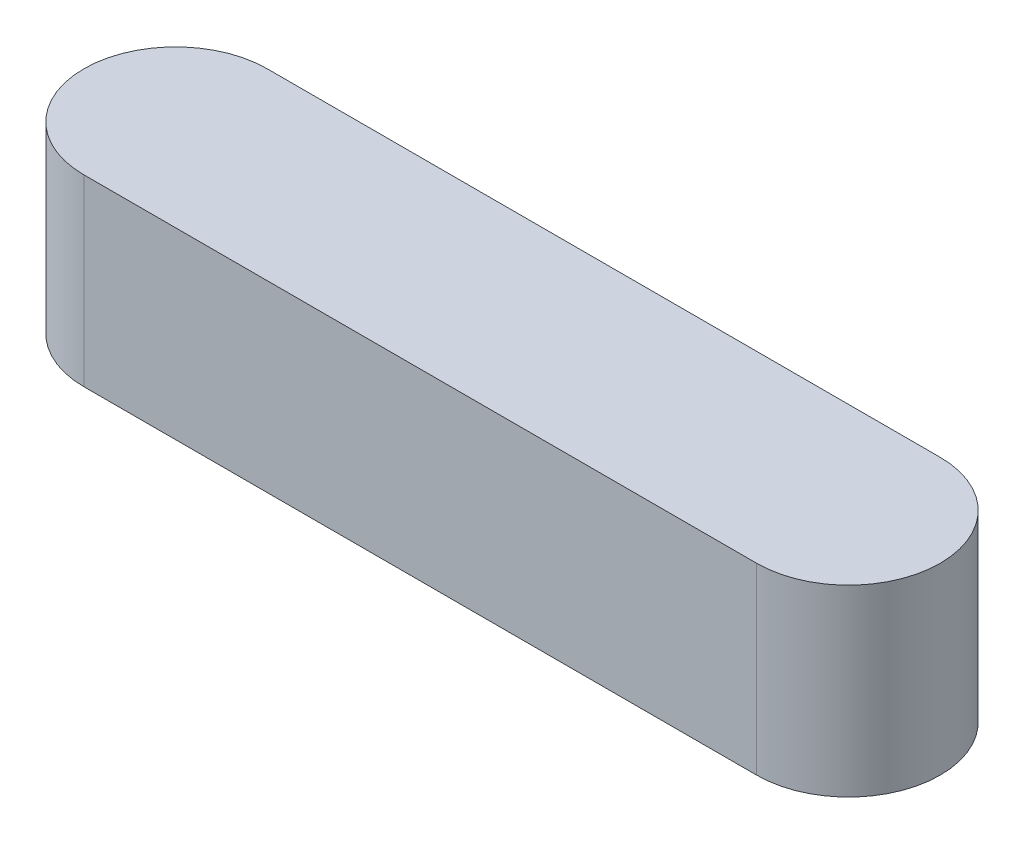
ISO-10303-21;
HEADER;
FILE_DESCRIPTION(('STEP AP214'),'2;1');
FILE_NAME('part.step','',(''),(''),'','','');
FILE_SCHEMA(('AUTOMOTIVE_DESIGN { 1 0 10303 214 1 1 1 1 }'));
ENDSEC;
DATA;
#1=APPLICATION_CONTEXT('core data for automotive mechanical design processes');
#2=APPLICATION_PROTOCOL_DEFINITION('international standard','automotive_design',2000,#1);
#3=PRODUCT_CONTEXT('',#1,'mechanical');
#4=PRODUCT('Part','Part','',(#3));
#5=PRODUCT_RELATED_PRODUCT_CATEGORY('part','',(#4));
#6=PRODUCT_DEFINITION_FORMATION('','',#4);
#7=PRODUCT_DEFINITION_CONTEXT('part definition',#1,'design');
#8=PRODUCT_DEFINITION('design','',#6,#7);
#9=PRODUCT_DEFINITION_SHAPE('','',#8);
#10=(LENGTH_UNIT() NAMED_UNIT(*) SI_UNIT(.MILLI.,.METRE.));
#11=(NAMED_UNIT(*) PLANE_ANGLE_UNIT() SI_UNIT($,.RADIAN.));
#12=(NAMED_UNIT(*) SI_UNIT($,.STERADIAN.) SOLID_ANGLE_UNIT());
#13=UNCERTAINTY_MEASURE_WITH_UNIT(LENGTH_MEASURE(1.E-05),#10,'distance_accuracy_value','');
#14=(GEOMETRIC_REPRESENTATION_CONTEXT(3) GLOBAL_UNCERTAINTY_ASSIGNED_CONTEXT((#13)) GLOBAL_UNIT_ASSIGNED_CONTEXT((#10,
#11,#12)) REPRESENTATION_CONTEXT('',''));
#15=CARTESIAN_POINT('',(0.,0.,0.));
#16=DIRECTION('',(0.,0.,1.));
#17=DIRECTION('',(1.,0.,0.));
#18=AXIS2_PLACEMENT_3D('',#15,#16,#17);
#19=CARTESIAN_POINT('',(0.,6.,0.));
#20=DIRECTION('',(0.,-1.,0.));
#21=DIRECTION('',(0.,0.,-1.));
#22=AXIS2_PLACEMENT_3D('',#19,#20,#21);
#23=CYLINDRICAL_SURFACE('',#22,3.);
#24=CARTESIAN_POINT('',(0.,0.,0.));
#25=DIRECTION('',(0.,1.,0.));
#26=DIRECTION('',(0.,0.,1.));
#27=AXIS2_PLACEMENT_3D('',#24,#25,#26);
#28=CIRCLE('',#27,3.);
#29=CARTESIAN_POINT('',(0.,0.,-3.));
#30=VERTEX_POINT('',#29);
#31=CARTESIAN_POINT('',(0.,0.,3.));
#32=VERTEX_POINT('',#31);
#33=EDGE_CURVE('E95',#30,#32,#28,.T.);
#34=ORIENTED_EDGE('',*,*,#33,.T.);
#35=DIRECTION('',(0.,-1.,0.));
#36=VECTOR('',#35,1.);
#37=CARTESIAN_POINT('',(0.,6.,3.));
#38=LINE('',#37,#36);
#39=CARTESIAN_POINT('',(0.,6.,3.));
#40=VERTEX_POINT('',#39);
#41=EDGE_CURVE('E11',#40,#32,#38,.T.);
#42=ORIENTED_EDGE('',*,*,#41,.F.);
#43=CARTESIAN_POINT('',(0.,6.,0.));
#44=DIRECTION('',(0.,1.,0.));
#45=DIRECTION('',(0.,0.,1.));
#46=AXIS2_PLACEMENT_3D('',#43,#44,#45);
#47=CIRCLE('',#46,3.);
#48=CARTESIAN_POINT('',(0.,6.,-3.));
#49=VERTEX_POINT('',#48);
#50=EDGE_CURVE('E83',#49,#40,#47,.T.);
#51=ORIENTED_EDGE('',*,*,#50,.F.);
#52=DIRECTION('',(0.,-1.,0.));
#53=VECTOR('',#52,1.);
#54=CARTESIAN_POINT('',(0.,6.,-3.));
#55=LINE('',#54,#53);
#56=EDGE_CURVE('E91',#49,#30,#55,.T.);
#57=ORIENTED_EDGE('',*,*,#56,.T.);
#58=EDGE_LOOP('',(#34,#42,#51,#57));
#59=FACE_BOUND('',#58,.T.);
#60=ADVANCED_FACE('F32',(#59),#23,.T.);
#61=CARTESIAN_POINT('',(0.,6.,3.));
#62=DIRECTION('',(0.,0.,-1.));
#63=DIRECTION('',(-1.,0.,0.));
#64=AXIS2_PLACEMENT_3D('',#61,#62,#63);
#65=PLANE('',#64);
#66=DIRECTION('',(1.,0.,0.));
#67=VECTOR('',#66,1.);
#68=CARTESIAN_POINT('',(0.,0.,3.));
#69=LINE('',#68,#67);
#70=CARTESIAN_POINT('',(22.,0.,3.));
#71=VERTEX_POINT('',#70);
#72=EDGE_CURVE('E87',#32,#71,#69,.T.);
#73=ORIENTED_EDGE('',*,*,#72,.T.);
#74=DIRECTION('',(0.,-1.,0.));
#75=VECTOR('',#74,1.);
#76=CARTESIAN_POINT('',(22.,6.,3.));
#77=LINE('',#76,#75);
#78=CARTESIAN_POINT('',(22.,6.,3.));
#79=VERTEX_POINT('',#78);
#80=EDGE_CURVE('E40',#79,#71,#77,.T.);
#81=ORIENTED_EDGE('',*,*,#80,.F.);
#82=DIRECTION('',(1.,0.,0.));
#83=VECTOR('',#82,1.);
#84=CARTESIAN_POINT('',(0.,6.,3.));
#85=LINE('',#84,#83);
#86=EDGE_CURVE('E78',#40,#79,#85,.T.);
#87=ORIENTED_EDGE('',*,*,#86,.F.);
#88=ORIENTED_EDGE('',*,*,#41,.T.);
#89=EDGE_LOOP('',(#73,#81,#87,#88));
#90=FACE_BOUND('',#89,.T.);
#91=ADVANCED_FACE('F86',(#90),#65,.F.);
#92=CARTESIAN_POINT('',(22.,6.,0.));
#93=DIRECTION('',(0.,-1.,0.));
#94=DIRECTION('',(0.,0.,-1.));
#95=AXIS2_PLACEMENT_3D('',#92,#93,#94);
#96=CYLINDRICAL_SURFACE('',#95,3.);
#97=CARTESIAN_POINT('',(22.,0.,0.));
#98=DIRECTION('',(0.,1.,0.));
#99=DIRECTION('',(0.,0.,1.));
#100=AXIS2_PLACEMENT_3D('',#97,#98,#99);
#101=CIRCLE('',#100,3.);
#102=CARTESIAN_POINT('',(22.,0.,-3.));
#103=VERTEX_POINT('',#102);
#104=EDGE_CURVE('E65',#71,#103,#101,.T.);
#105=ORIENTED_EDGE('',*,*,#104,.T.);
#106=DIRECTION('',(0.,-1.,0.));
#107=VECTOR('',#106,1.);
#108=CARTESIAN_POINT('',(22.,6.,-3.));
#109=LINE('',#108,#107);
#110=CARTESIAN_POINT('',(22.,6.,-3.));
#111=VERTEX_POINT('',#110);
#112=EDGE_CURVE('E88',#111,#103,#109,.T.);
#113=ORIENTED_EDGE('',*,*,#112,.F.);
#114=CARTESIAN_POINT('',(22.,6.,0.));
#115=DIRECTION('',(0.,1.,0.));
#116=DIRECTION('',(0.,0.,1.));
#117=AXIS2_PLACEMENT_3D('',#114,#115,#116);
#118=CIRCLE('',#117,3.);
#119=EDGE_CURVE('E81',#79,#111,#118,.T.);
#120=ORIENTED_EDGE('',*,*,#119,.F.);
#121=ORIENTED_EDGE('',*,*,#80,.T.);
#122=EDGE_LOOP('',(#105,#113,#120,#121));
#123=FACE_BOUND('',#122,.T.);
#124=ADVANCED_FACE('F89',(#123),#96,.T.);
#125=CARTESIAN_POINT('',(0.,6.,-3.));
#126=DIRECTION('',(0.,0.,1.));
#127=DIRECTION('',(1.,0.,0.));
#128=AXIS2_PLACEMENT_3D('',#125,#126,#127);
#129=PLANE('',#128);
#130=DIRECTION('',(-1.,0.,0.));
#131=VECTOR('',#130,1.);
#132=CARTESIAN_POINT('',(0.,0.,-3.));
#133=LINE('',#132,#131);
#134=EDGE_CURVE('E71',#103,#30,#133,.T.);
#135=ORIENTED_EDGE('',*,*,#134,.T.);
#136=ORIENTED_EDGE('',*,*,#56,.F.);
#137=DIRECTION('',(-1.,0.,0.));
#138=VECTOR('',#137,1.);
#139=CARTESIAN_POINT('',(0.,6.,-3.));
#140=LINE('',#139,#138);
#141=EDGE_CURVE('E48',#111,#49,#140,.T.);
#142=ORIENTED_EDGE('',*,*,#141,.F.);
#143=ORIENTED_EDGE('',*,*,#112,.T.);
#144=EDGE_LOOP('',(#135,#136,#142,#143));
#145=FACE_BOUND('',#144,.T.);
#146=ADVANCED_FACE('F102',(#145),#129,.F.);
#147=CARTESIAN_POINT('',(0.,6.,0.));
#148=DIRECTION('',(0.,1.,0.));
#149=DIRECTION('',(0.,0.,1.));
#150=AXIS2_PLACEMENT_3D('',#147,#148,#149);
#151=PLANE('',#150);
#152=ORIENTED_EDGE('',*,*,#50,.T.);
#153=ORIENTED_EDGE('',*,*,#86,.T.);
#154=ORIENTED_EDGE('',*,*,#119,.T.);
#155=ORIENTED_EDGE('',*,*,#141,.T.);
#156=EDGE_LOOP('',(#152,#153,#154,#155));
#157=FACE_BOUND('',#156,.T.);
#158=ADVANCED_FACE('F79',(#157),#151,.T.);
#159=CARTESIAN_POINT('',(0.,0.,0.));
#160=DIRECTION('',(0.,1.,0.));
#161=DIRECTION('',(0.,0.,1.));
#162=AXIS2_PLACEMENT_3D('',#159,#160,#161);
#163=PLANE('',#162);
#164=ORIENTED_EDGE('',*,*,#33,.F.);
#165=ORIENTED_EDGE('',*,*,#134,.F.);
#166=ORIENTED_EDGE('',*,*,#104,.F.);
#167=ORIENTED_EDGE('',*,*,#72,.F.);
#168=EDGE_LOOP('',(#164,#165,#166,#167));
#169=FACE_BOUND('',#168,.T.);
#170=ADVANCED_FACE('F105',(#169),#163,.F.);
#171=CLOSED_SHELL('',(#60,#91,#124,#146,#158,#170));
#172=MANIFOLD_SOLID_BREP('B2',#171);
#173=ADVANCED_BREP_SHAPE_REPRESENTATION('',(#18,#172),#14);
#174=SHAPE_DEFINITION_REPRESENTATION(#9,#173);
ENDSEC;
END-ISO-10303-21;
